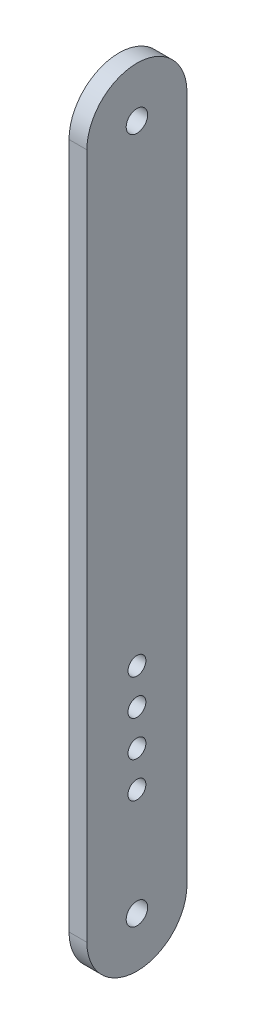
ISO-10303-21;
HEADER;
FILE_DESCRIPTION(('STEP AP214'),'2;1');
FILE_NAME('part.step','',(''),(''),'','','');
FILE_SCHEMA(('AUTOMOTIVE_DESIGN { 1 0 10303 214 1 1 1 1 }'));
ENDSEC;
DATA;
#1=APPLICATION_CONTEXT('core data for automotive mechanical design processes');
#2=APPLICATION_PROTOCOL_DEFINITION('international standard','automotive_design',2000,#1);
#3=PRODUCT_CONTEXT('',#1,'mechanical');
#4=PRODUCT('Part','Part','',(#3));
#5=PRODUCT_RELATED_PRODUCT_CATEGORY('part','',(#4));
#6=PRODUCT_DEFINITION_FORMATION('','',#4);
#7=PRODUCT_DEFINITION_CONTEXT('part definition',#1,'design');
#8=PRODUCT_DEFINITION('design','',#6,#7);
#9=PRODUCT_DEFINITION_SHAPE('','',#8);
#10=(LENGTH_UNIT() NAMED_UNIT(*) SI_UNIT(.MILLI.,.METRE.));
#11=(NAMED_UNIT(*) PLANE_ANGLE_UNIT() SI_UNIT($,.RADIAN.));
#12=(NAMED_UNIT(*) SI_UNIT($,.STERADIAN.) SOLID_ANGLE_UNIT());
#13=UNCERTAINTY_MEASURE_WITH_UNIT(LENGTH_MEASURE(1.E-05),#10,'distance_accuracy_value','');
#14=(GEOMETRIC_REPRESENTATION_CONTEXT(3) GLOBAL_UNCERTAINTY_ASSIGNED_CONTEXT((#13)) GLOBAL_UNIT_ASSIGNED_CONTEXT((#10,
#11,#12)) REPRESENTATION_CONTEXT('',''));
#15=CARTESIAN_POINT('',(0.,0.,0.));
#16=DIRECTION('',(0.,0.,1.));
#17=DIRECTION('',(1.,0.,0.));
#18=AXIS2_PLACEMENT_3D('',#15,#16,#17);
#19=CARTESIAN_POINT('',(2.5,0.,0.));
#20=DIRECTION('',(1.,0.,0.));
#21=DIRECTION('',(0.,0.,-1.));
#22=AXIS2_PLACEMENT_3D('',#19,#20,#21);
#23=PLANE('',#22);
#24=CARTESIAN_POINT('',(2.5,30.,0.));
#25=DIRECTION('',(1.,0.,0.));
#26=DIRECTION('',(0.,0.,-1.));
#27=AXIS2_PLACEMENT_3D('',#24,#25,#26);
#28=CIRCLE('',#27,1.25);
#29=CARTESIAN_POINT('',(2.5,30.,-1.24999999999995));
#30=VERTEX_POINT('',#29);
#31=EDGE_CURVE('E223',#30,#30,#28,.T.);
#32=ORIENTED_EDGE('',*,*,#31,.F.);
#33=EDGE_LOOP('',(#32));
#34=FACE_BOUND('',#33,.T.);
#35=CARTESIAN_POINT('',(2.5,20.,0.));
#36=DIRECTION('',(1.,0.,0.));
#37=DIRECTION('',(0.,0.,-1.));
#38=AXIS2_PLACEMENT_3D('',#35,#36,#37);
#39=CIRCLE('',#38,1.25);
#40=CARTESIAN_POINT('',(2.5,20.,-1.24999999999998));
#41=VERTEX_POINT('',#40);
#42=EDGE_CURVE('E211',#41,#41,#39,.T.);
#43=ORIENTED_EDGE('',*,*,#42,.F.);
#44=EDGE_LOOP('',(#43));
#45=FACE_BOUND('',#44,.T.);
#46=CARTESIAN_POINT('',(2.5,96.,0.));
#47=DIRECTION('',(1.,0.,0.));
#48=DIRECTION('',(0.,0.,-1.));
#49=AXIS2_PLACEMENT_3D('',#46,#47,#48);
#50=CIRCLE('',#49,1.5);
#51=CARTESIAN_POINT('',(2.5,96.,-1.5));
#52=VERTEX_POINT('',#51);
#53=EDGE_CURVE('E192',#52,#52,#50,.T.);
#54=ORIENTED_EDGE('',*,*,#53,.F.);
#55=EDGE_LOOP('',(#54));
#56=FACE_BOUND('',#55,.T.);
#57=CARTESIAN_POINT('',(2.5,0.,0.));
#58=DIRECTION('',(1.,0.,0.));
#59=DIRECTION('',(0.,0.,-1.));
#60=AXIS2_PLACEMENT_3D('',#57,#58,#59);
#61=CIRCLE('',#60,7.);
#62=CARTESIAN_POINT('',(2.5,0.,7.));
#63=VERTEX_POINT('',#62);
#64=CARTESIAN_POINT('',(2.5,0.,-7.));
#65=VERTEX_POINT('',#64);
#66=EDGE_CURVE('E176',#63,#65,#61,.T.);
#67=ORIENTED_EDGE('',*,*,#66,.T.);
#68=DIRECTION('',(0.,1.,0.));
#69=VECTOR('',#68,1.);
#70=CARTESIAN_POINT('',(2.5,0.,-7.));
#71=LINE('',#70,#69);
#72=CARTESIAN_POINT('',(2.5,96.,-7.));
#73=VERTEX_POINT('',#72);
#74=EDGE_CURVE('E169',#65,#73,#71,.T.);
#75=ORIENTED_EDGE('',*,*,#74,.T.);
#76=CARTESIAN_POINT('',(2.5,96.,0.));
#77=DIRECTION('',(1.,0.,0.));
#78=DIRECTION('',(0.,0.,-1.));
#79=AXIS2_PLACEMENT_3D('',#76,#77,#78);
#80=CIRCLE('',#79,7.);
#81=CARTESIAN_POINT('',(2.5,96.,7.));
#82=VERTEX_POINT('',#81);
#83=EDGE_CURVE('E175',#73,#82,#80,.T.);
#84=ORIENTED_EDGE('',*,*,#83,.T.);
#85=DIRECTION('',(0.,1.,0.));
#86=VECTOR('',#85,1.);
#87=CARTESIAN_POINT('',(2.5,0.,7.));
#88=LINE('',#87,#86);
#89=EDGE_CURVE('E185',#63,#82,#88,.T.);
#90=ORIENTED_EDGE('',*,*,#89,.F.);
#91=EDGE_LOOP('',(#67,#75,#84,#90));
#92=FACE_BOUND('',#91,.T.);
#93=CARTESIAN_POINT('',(2.5,0.,0.));
#94=DIRECTION('',(1.,0.,0.));
#95=DIRECTION('',(0.,0.,-1.));
#96=AXIS2_PLACEMENT_3D('',#93,#94,#95);
#97=CIRCLE('',#96,1.5);
#98=CARTESIAN_POINT('',(2.5,0.,-1.5));
#99=VERTEX_POINT('',#98);
#100=EDGE_CURVE('E205',#99,#99,#97,.T.);
#101=ORIENTED_EDGE('',*,*,#100,.F.);
#102=EDGE_LOOP('',(#101));
#103=FACE_BOUND('',#102,.T.);
#104=CARTESIAN_POINT('',(2.5,25.,0.));
#105=DIRECTION('',(1.,0.,0.));
#106=DIRECTION('',(0.,0.,-1.));
#107=AXIS2_PLACEMENT_3D('',#104,#105,#106);
#108=CIRCLE('',#107,1.25);
#109=CARTESIAN_POINT('',(2.5,25.,-1.24999999999997));
#110=VERTEX_POINT('',#109);
#111=EDGE_CURVE('E217',#110,#110,#108,.T.);
#112=ORIENTED_EDGE('',*,*,#111,.F.);
#113=EDGE_LOOP('',(#112));
#114=FACE_BOUND('',#113,.T.);
#115=CARTESIAN_POINT('',(2.5,15.,0.));
#116=DIRECTION('',(1.,0.,0.));
#117=DIRECTION('',(0.,0.,-1.));
#118=AXIS2_PLACEMENT_3D('',#115,#116,#117);
#119=CIRCLE('',#118,1.25);
#120=CARTESIAN_POINT('',(2.5,15.,-1.25));
#121=VERTEX_POINT('',#120);
#122=EDGE_CURVE('E229',#121,#121,#119,.T.);
#123=ORIENTED_EDGE('',*,*,#122,.F.);
#124=EDGE_LOOP('',(#123));
#125=FACE_BOUND('',#124,.T.);
#126=ADVANCED_FACE('F126',(#34,#45,#56,#92,#103,#114,#125),#23,.T.);
#127=CARTESIAN_POINT('',(0.,0.,0.));
#128=DIRECTION('',(1.,0.,0.));
#129=DIRECTION('',(0.,0.,-1.));
#130=AXIS2_PLACEMENT_3D('',#127,#128,#129);
#131=PLANE('',#130);
#132=CARTESIAN_POINT('',(0.,0.,0.));
#133=DIRECTION('',(1.,0.,0.));
#134=DIRECTION('',(0.,0.,-1.));
#135=AXIS2_PLACEMENT_3D('',#132,#133,#134);
#136=CIRCLE('',#135,7.);
#137=CARTESIAN_POINT('',(0.,0.,7.));
#138=VERTEX_POINT('',#137);
#139=CARTESIAN_POINT('',(0.,0.,-7.));
#140=VERTEX_POINT('',#139);
#141=EDGE_CURVE('E190',#138,#140,#136,.T.);
#142=ORIENTED_EDGE('',*,*,#141,.F.);
#143=DIRECTION('',(0.,1.,0.));
#144=VECTOR('',#143,1.);
#145=CARTESIAN_POINT('',(0.,0.,7.));
#146=LINE('',#145,#144);
#147=CARTESIAN_POINT('',(0.,96.,7.));
#148=VERTEX_POINT('',#147);
#149=EDGE_CURVE('E196',#138,#148,#146,.T.);
#150=ORIENTED_EDGE('',*,*,#149,.T.);
#151=CARTESIAN_POINT('',(0.,96.,0.));
#152=DIRECTION('',(1.,0.,0.));
#153=DIRECTION('',(0.,0.,-1.));
#154=AXIS2_PLACEMENT_3D('',#151,#152,#153);
#155=CIRCLE('',#154,7.);
#156=CARTESIAN_POINT('',(0.,96.,-7.));
#157=VERTEX_POINT('',#156);
#158=EDGE_CURVE('E194',#157,#148,#155,.T.);
#159=ORIENTED_EDGE('',*,*,#158,.F.);
#160=DIRECTION('',(0.,1.,0.));
#161=VECTOR('',#160,1.);
#162=CARTESIAN_POINT('',(0.,0.,-7.));
#163=LINE('',#162,#161);
#164=EDGE_CURVE('E181',#140,#157,#163,.T.);
#165=ORIENTED_EDGE('',*,*,#164,.F.);
#166=EDGE_LOOP('',(#142,#150,#159,#165));
#167=FACE_BOUND('',#166,.T.);
#168=CARTESIAN_POINT('',(0.,96.,0.));
#169=DIRECTION('',(1.,0.,0.));
#170=DIRECTION('',(0.,0.,-1.));
#171=AXIS2_PLACEMENT_3D('',#168,#169,#170);
#172=CIRCLE('',#171,1.5);
#173=CARTESIAN_POINT('',(0.,96.,-1.5));
#174=VERTEX_POINT('',#173);
#175=EDGE_CURVE('E202',#174,#174,#172,.T.);
#176=ORIENTED_EDGE('',*,*,#175,.T.);
#177=EDGE_LOOP('',(#176));
#178=FACE_BOUND('',#177,.T.);
#179=CARTESIAN_POINT('',(0.,0.,0.));
#180=DIRECTION('',(1.,0.,0.));
#181=DIRECTION('',(0.,0.,-1.));
#182=AXIS2_PLACEMENT_3D('',#179,#180,#181);
#183=CIRCLE('',#182,1.5);
#184=CARTESIAN_POINT('',(0.,0.,-1.5));
#185=VERTEX_POINT('',#184);
#186=EDGE_CURVE('E208',#185,#185,#183,.T.);
#187=ORIENTED_EDGE('',*,*,#186,.T.);
#188=EDGE_LOOP('',(#187));
#189=FACE_BOUND('',#188,.T.);
#190=CARTESIAN_POINT('',(0.,20.,0.));
#191=DIRECTION('',(1.,0.,0.));
#192=DIRECTION('',(0.,0.,-1.));
#193=AXIS2_PLACEMENT_3D('',#190,#191,#192);
#194=CIRCLE('',#193,1.25);
#195=CARTESIAN_POINT('',(0.,20.,-1.24999999999998));
#196=VERTEX_POINT('',#195);
#197=EDGE_CURVE('E214',#196,#196,#194,.T.);
#198=ORIENTED_EDGE('',*,*,#197,.T.);
#199=EDGE_LOOP('',(#198));
#200=FACE_BOUND('',#199,.T.);
#201=CARTESIAN_POINT('',(0.,25.,0.));
#202=DIRECTION('',(1.,0.,0.));
#203=DIRECTION('',(0.,0.,-1.));
#204=AXIS2_PLACEMENT_3D('',#201,#202,#203);
#205=CIRCLE('',#204,1.25);
#206=CARTESIAN_POINT('',(0.,25.,-1.24999999999997));
#207=VERTEX_POINT('',#206);
#208=EDGE_CURVE('E220',#207,#207,#205,.T.);
#209=ORIENTED_EDGE('',*,*,#208,.T.);
#210=EDGE_LOOP('',(#209));
#211=FACE_BOUND('',#210,.T.);
#212=CARTESIAN_POINT('',(0.,30.,0.));
#213=DIRECTION('',(1.,0.,0.));
#214=DIRECTION('',(0.,0.,-1.));
#215=AXIS2_PLACEMENT_3D('',#212,#213,#214);
#216=CIRCLE('',#215,1.25);
#217=CARTESIAN_POINT('',(0.,30.,-1.24999999999995));
#218=VERTEX_POINT('',#217);
#219=EDGE_CURVE('E226',#218,#218,#216,.T.);
#220=ORIENTED_EDGE('',*,*,#219,.T.);
#221=EDGE_LOOP('',(#220));
#222=FACE_BOUND('',#221,.T.);
#223=CARTESIAN_POINT('',(0.,15.,0.));
#224=DIRECTION('',(1.,0.,0.));
#225=DIRECTION('',(0.,0.,-1.));
#226=AXIS2_PLACEMENT_3D('',#223,#224,#225);
#227=CIRCLE('',#226,1.25);
#228=CARTESIAN_POINT('',(0.,15.,-1.25));
#229=VERTEX_POINT('',#228);
#230=EDGE_CURVE('E232',#229,#229,#227,.T.);
#231=ORIENTED_EDGE('',*,*,#230,.T.);
#232=EDGE_LOOP('',(#231));
#233=FACE_BOUND('',#232,.T.);
#234=ADVANCED_FACE('F242',(#167,#178,#189,#200,#211,#222,#233),#131,.F.);
#235=CARTESIAN_POINT('',(2.5,0.,0.));
#236=DIRECTION('',(-1.,0.,0.));
#237=DIRECTION('',(0.,0.,1.));
#238=AXIS2_PLACEMENT_3D('',#235,#236,#237);
#239=CYLINDRICAL_SURFACE('',#238,7.);
#240=ORIENTED_EDGE('',*,*,#141,.T.);
#241=DIRECTION('',(-1.,0.,0.));
#242=VECTOR('',#241,1.);
#243=CARTESIAN_POINT('',(2.5,0.,-7.));
#244=LINE('',#243,#242);
#245=EDGE_CURVE('E12',#65,#140,#244,.T.);
#246=ORIENTED_EDGE('',*,*,#245,.F.);
#247=ORIENTED_EDGE('',*,*,#66,.F.);
#248=DIRECTION('',(-1.,0.,0.));
#249=VECTOR('',#248,1.);
#250=CARTESIAN_POINT('',(2.5,0.,7.));
#251=LINE('',#250,#249);
#252=EDGE_CURVE('E143',#63,#138,#251,.T.);
#253=ORIENTED_EDGE('',*,*,#252,.T.);
#254=EDGE_LOOP('',(#240,#246,#247,#253));
#255=FACE_BOUND('',#254,.T.);
#256=ADVANCED_FACE('F128',(#255),#239,.T.);
#257=CARTESIAN_POINT('',(2.5,0.,-7.));
#258=DIRECTION('',(0.,0.,1.));
#259=DIRECTION('',(1.,0.,0.));
#260=AXIS2_PLACEMENT_3D('',#257,#258,#259);
#261=PLANE('',#260);
#262=ORIENTED_EDGE('',*,*,#164,.T.);
#263=DIRECTION('',(-1.,0.,0.));
#264=VECTOR('',#263,1.);
#265=CARTESIAN_POINT('',(2.5,96.,-7.));
#266=LINE('',#265,#264);
#267=EDGE_CURVE('E135',#73,#157,#266,.T.);
#268=ORIENTED_EDGE('',*,*,#267,.F.);
#269=ORIENTED_EDGE('',*,*,#74,.F.);
#270=ORIENTED_EDGE('',*,*,#245,.T.);
#271=EDGE_LOOP('',(#262,#268,#269,#270));
#272=FACE_BOUND('',#271,.T.);
#273=ADVANCED_FACE('F180',(#272),#261,.F.);
#274=CARTESIAN_POINT('',(2.5,96.,0.));
#275=DIRECTION('',(-1.,0.,0.));
#276=DIRECTION('',(0.,0.,1.));
#277=AXIS2_PLACEMENT_3D('',#274,#275,#276);
#278=CYLINDRICAL_SURFACE('',#277,7.);
#279=ORIENTED_EDGE('',*,*,#158,.T.);
#280=DIRECTION('',(-1.,0.,0.));
#281=VECTOR('',#280,1.);
#282=CARTESIAN_POINT('',(2.5,96.,7.));
#283=LINE('',#282,#281);
#284=EDGE_CURVE('E158',#82,#148,#283,.T.);
#285=ORIENTED_EDGE('',*,*,#284,.F.);
#286=ORIENTED_EDGE('',*,*,#83,.F.);
#287=ORIENTED_EDGE('',*,*,#267,.T.);
#288=EDGE_LOOP('',(#279,#285,#286,#287));
#289=FACE_BOUND('',#288,.T.);
#290=ADVANCED_FACE('F184',(#289),#278,.T.);
#291=CARTESIAN_POINT('',(2.5,0.,7.));
#292=DIRECTION('',(0.,0.,1.));
#293=DIRECTION('',(1.,0.,0.));
#294=AXIS2_PLACEMENT_3D('',#291,#292,#293);
#295=PLANE('',#294);
#296=ORIENTED_EDGE('',*,*,#149,.F.);
#297=ORIENTED_EDGE('',*,*,#252,.F.);
#298=ORIENTED_EDGE('',*,*,#89,.T.);
#299=ORIENTED_EDGE('',*,*,#284,.T.);
#300=EDGE_LOOP('',(#296,#297,#298,#299));
#301=FACE_BOUND('',#300,.T.);
#302=ADVANCED_FACE('F255',(#301),#295,.T.);
#303=CARTESIAN_POINT('',(2.5,96.,0.));
#304=DIRECTION('',(-1.,0.,0.));
#305=DIRECTION('',(0.,0.,1.));
#306=AXIS2_PLACEMENT_3D('',#303,#304,#305);
#307=CYLINDRICAL_SURFACE('',#306,1.5);
#308=ORIENTED_EDGE('',*,*,#53,.T.);
#309=EDGE_LOOP('',(#308));
#310=FACE_BOUND('',#309,.T.);
#311=ORIENTED_EDGE('',*,*,#175,.F.);
#312=EDGE_LOOP('',(#311));
#313=FACE_BOUND('',#312,.T.);
#314=ADVANCED_FACE('F252',(#310,#313),#307,.F.);
#315=CARTESIAN_POINT('',(2.5,0.,0.));
#316=DIRECTION('',(-1.,0.,0.));
#317=DIRECTION('',(0.,0.,1.));
#318=AXIS2_PLACEMENT_3D('',#315,#316,#317);
#319=CYLINDRICAL_SURFACE('',#318,1.5);
#320=ORIENTED_EDGE('',*,*,#100,.T.);
#321=EDGE_LOOP('',(#320));
#322=FACE_BOUND('',#321,.T.);
#323=ORIENTED_EDGE('',*,*,#186,.F.);
#324=EDGE_LOOP('',(#323));
#325=FACE_BOUND('',#324,.T.);
#326=ADVANCED_FACE('F292',(#322,#325),#319,.F.);
#327=CARTESIAN_POINT('',(2.5,20.,0.));
#328=DIRECTION('',(-1.,0.,0.));
#329=DIRECTION('',(0.,0.,1.));
#330=AXIS2_PLACEMENT_3D('',#327,#328,#329);
#331=CYLINDRICAL_SURFACE('',#330,1.25);
#332=ORIENTED_EDGE('',*,*,#42,.T.);
#333=EDGE_LOOP('',(#332));
#334=FACE_BOUND('',#333,.T.);
#335=ORIENTED_EDGE('',*,*,#197,.F.);
#336=EDGE_LOOP('',(#335));
#337=FACE_BOUND('',#336,.T.);
#338=ADVANCED_FACE('F289',(#334,#337),#331,.F.);
#339=CARTESIAN_POINT('',(2.5,25.,0.));
#340=DIRECTION('',(-1.,0.,0.));
#341=DIRECTION('',(0.,0.,1.));
#342=AXIS2_PLACEMENT_3D('',#339,#340,#341);
#343=CYLINDRICAL_SURFACE('',#342,1.25);
#344=ORIENTED_EDGE('',*,*,#111,.T.);
#345=EDGE_LOOP('',(#344));
#346=FACE_BOUND('',#345,.T.);
#347=ORIENTED_EDGE('',*,*,#208,.F.);
#348=EDGE_LOOP('',(#347));
#349=FACE_BOUND('',#348,.T.);
#350=ADVANCED_FACE('F283',(#346,#349),#343,.F.);
#351=CARTESIAN_POINT('',(2.5,30.,0.));
#352=DIRECTION('',(-1.,0.,0.));
#353=DIRECTION('',(0.,0.,1.));
#354=AXIS2_PLACEMENT_3D('',#351,#352,#353);
#355=CYLINDRICAL_SURFACE('',#354,1.25);
#356=ORIENTED_EDGE('',*,*,#31,.T.);
#357=EDGE_LOOP('',(#356));
#358=FACE_BOUND('',#357,.T.);
#359=ORIENTED_EDGE('',*,*,#219,.F.);
#360=EDGE_LOOP('',(#359));
#361=FACE_BOUND('',#360,.T.);
#362=ADVANCED_FACE('F278',(#358,#361),#355,.F.);
#363=CARTESIAN_POINT('',(2.5,15.,0.));
#364=DIRECTION('',(-1.,0.,0.));
#365=DIRECTION('',(0.,0.,1.));
#366=AXIS2_PLACEMENT_3D('',#363,#364,#365);
#367=CYLINDRICAL_SURFACE('',#366,1.25);
#368=ORIENTED_EDGE('',*,*,#122,.T.);
#369=EDGE_LOOP('',(#368));
#370=FACE_BOUND('',#369,.T.);
#371=ORIENTED_EDGE('',*,*,#230,.F.);
#372=EDGE_LOOP('',(#371));
#373=FACE_BOUND('',#372,.T.);
#374=ADVANCED_FACE('F238',(#370,#373),#367,.F.);
#375=CLOSED_SHELL('',(#126,#234,#256,#273,#290,#302,#314,#326,#338,#350,#362,#374));
#376=MANIFOLD_SOLID_BREP('B2',#375);
#377=ADVANCED_BREP_SHAPE_REPRESENTATION('',(#18,#376),#14);
#378=SHAPE_DEFINITION_REPRESENTATION(#9,#377);
ENDSEC;
END-ISO-10303-21;
